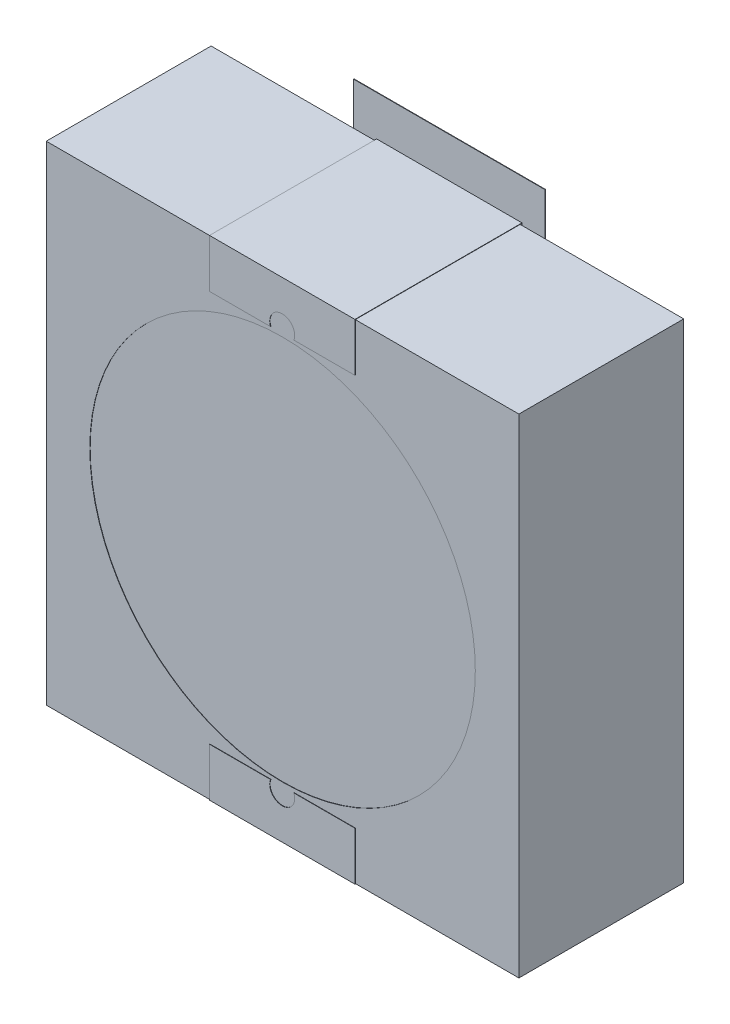
ISO-10303-21;
HEADER;
FILE_DESCRIPTION(('STEP AP214'),'2;1');
FILE_NAME('part.step','',(''),(''),'','','');
FILE_SCHEMA(('AUTOMOTIVE_DESIGN { 1 0 10303 214 1 1 1 1 }'));
ENDSEC;
DATA;
#1=APPLICATION_CONTEXT('core data for automotive mechanical design processes');
#2=APPLICATION_PROTOCOL_DEFINITION('international standard','automotive_design',2000,#1);
#3=PRODUCT_CONTEXT('',#1,'mechanical');
#4=PRODUCT('Part','Part','',(#3));
#5=PRODUCT_RELATED_PRODUCT_CATEGORY('part','',(#4));
#6=PRODUCT_DEFINITION_FORMATION('','',#4);
#7=PRODUCT_DEFINITION_CONTEXT('part definition',#1,'design');
#8=PRODUCT_DEFINITION('design','',#6,#7);
#9=PRODUCT_DEFINITION_SHAPE('','',#8);
#10=(LENGTH_UNIT() NAMED_UNIT(*) SI_UNIT(.MILLI.,.METRE.));
#11=(NAMED_UNIT(*) PLANE_ANGLE_UNIT() SI_UNIT($,.RADIAN.));
#12=(NAMED_UNIT(*) SI_UNIT($,.STERADIAN.) SOLID_ANGLE_UNIT());
#13=UNCERTAINTY_MEASURE_WITH_UNIT(LENGTH_MEASURE(1.E-05),#10,'distance_accuracy_value','');
#14=(GEOMETRIC_REPRESENTATION_CONTEXT(3) GLOBAL_UNCERTAINTY_ASSIGNED_CONTEXT((#13)) GLOBAL_UNIT_ASSIGNED_CONTEXT((#10,
#11,#12)) REPRESENTATION_CONTEXT('',''));
#15=CARTESIAN_POINT('',(0.,0.,0.));
#16=DIRECTION('',(0.,0.,1.));
#17=DIRECTION('',(1.,0.,0.));
#18=AXIS2_PLACEMENT_3D('',#15,#16,#17);
#19=CARTESIAN_POINT('',(-1.524,4.10972,0.0762));
#20=DIRECTION('',(0.,0.,-1.));
#21=DIRECTION('',(-1.,0.,0.));
#22=AXIS2_PLACEMENT_3D('',#19,#20,#21);
#23=PLANE('',#22);
#24=DIRECTION('',(1.,0.,0.));
#25=VECTOR('',#24,1.);
#26=CARTESIAN_POINT('',(2.0049998,-1.6500094,0.0762));
#27=LINE('',#26,#25);
#28=CARTESIAN_POINT('',(2.0049998,-1.6500094,0.0762));
#29=VERTEX_POINT('',#28);
#30=CARTESIAN_POINT('',(-2.0049998,-1.6500094,0.0762));
#31=VERTEX_POINT('',#30);
#32=EDGE_CURVE('E252',#29,#31,#27,.F.);
#33=ORIENTED_EDGE('',*,*,#32,.F.);
#34=DIRECTION('',(0.,1.,0.));
#35=VECTOR('',#34,1.);
#36=CARTESIAN_POINT('',(2.0049998,-5.9699906,0.0762));
#37=LINE('',#36,#35);
#38=CARTESIAN_POINT('',(2.0049998,-5.9699906,0.0762));
#39=VERTEX_POINT('',#38);
#40=EDGE_CURVE('E344',#39,#29,#37,.T.);
#41=ORIENTED_EDGE('',*,*,#40,.F.);
#42=DIRECTION('',(1.,0.,0.));
#43=VECTOR('',#42,1.);
#44=CARTESIAN_POINT('',(-2.0049998,-5.9699906,0.0762));
#45=LINE('',#44,#43);
#46=CARTESIAN_POINT('',(-2.0049998,-5.9699906,0.0762));
#47=VERTEX_POINT('',#46);
#48=EDGE_CURVE('E352',#47,#39,#45,.T.);
#49=ORIENTED_EDGE('',*,*,#48,.F.);
#50=DIRECTION('',(0.,1.,0.));
#51=VECTOR('',#50,1.);
#52=CARTESIAN_POINT('',(-2.0049998,-1.6500094,0.0762));
#53=LINE('',#52,#51);
#54=EDGE_CURVE('E357',#31,#47,#53,.F.);
#55=ORIENTED_EDGE('',*,*,#54,.F.);
#56=EDGE_LOOP('',(#33,#41,#49,#55));
#57=FACE_BOUND('',#56,.T.);
#58=ADVANCED_FACE('F16',(#57),#23,.T.);
#59=CARTESIAN_POINT('',(-1.524,4.10972,0.0762));
#60=DIRECTION('',(0.,0.,-1.));
#61=DIRECTION('',(-1.,0.,0.));
#62=AXIS2_PLACEMENT_3D('',#59,#60,#61);
#63=PLANE('',#62);
#64=DIRECTION('',(1.,0.,0.));
#65=VECTOR('',#64,1.);
#66=CARTESIAN_POINT('',(2.0049998,5.9699906,0.0762));
#67=LINE('',#66,#65);
#68=CARTESIAN_POINT('',(2.0049998,5.9699906,0.0762));
#69=VERTEX_POINT('',#68);
#70=CARTESIAN_POINT('',(-2.0049998,5.9699906,0.0762));
#71=VERTEX_POINT('',#70);
#72=EDGE_CURVE('E340',#69,#71,#67,.F.);
#73=ORIENTED_EDGE('',*,*,#72,.F.);
#74=DIRECTION('',(0.,1.,0.));
#75=VECTOR('',#74,1.);
#76=CARTESIAN_POINT('',(2.0049998,1.6500094,0.0762));
#77=LINE('',#76,#75);
#78=CARTESIAN_POINT('',(2.0049998,1.6500094,0.0762));
#79=VERTEX_POINT('',#78);
#80=EDGE_CURVE('E294',#79,#69,#77,.T.);
#81=ORIENTED_EDGE('',*,*,#80,.F.);
#82=DIRECTION('',(1.,0.,0.));
#83=VECTOR('',#82,1.);
#84=CARTESIAN_POINT('',(-2.0049998,1.6500094,0.0762));
#85=LINE('',#84,#83);
#86=CARTESIAN_POINT('',(-2.0049998,1.6500094,0.0762));
#87=VERTEX_POINT('',#86);
#88=EDGE_CURVE('E433',#87,#79,#85,.T.);
#89=ORIENTED_EDGE('',*,*,#88,.F.);
#90=DIRECTION('',(0.,1.,0.));
#91=VECTOR('',#90,1.);
#92=CARTESIAN_POINT('',(-2.0049998,5.9699906,0.0762));
#93=LINE('',#92,#91);
#94=EDGE_CURVE('E438',#71,#87,#93,.F.);
#95=ORIENTED_EDGE('',*,*,#94,.F.);
#96=EDGE_LOOP('',(#73,#81,#89,#95));
#97=FACE_BOUND('',#96,.T.);
#98=ADVANCED_FACE('F451',(#97),#63,.T.);
#99=CARTESIAN_POINT('',(-1.524,5.12572,3.58902));
#100=DIRECTION('',(0.,0.,1.));
#101=DIRECTION('',(1.,0.,0.));
#102=AXIS2_PLACEMENT_3D('',#99,#100,#101);
#103=PLANE('',#102);
#104=DIRECTION('',(1.,0.,0.));
#105=VECTOR('',#104,1.);
#106=CARTESIAN_POINT('',(-1.524,4.10972,3.58902));
#107=LINE('',#106,#105);
#108=CARTESIAN_POINT('',(-1.524,4.10972,3.58902));
#109=VERTEX_POINT('',#108);
#110=CARTESIAN_POINT('',(-0.244157293562977,4.10972,3.58902));
#111=VERTEX_POINT('',#110);
#112=EDGE_CURVE('E221',#109,#111,#107,.T.);
#113=ORIENTED_EDGE('',*,*,#112,.T.);
#114=CARTESIAN_POINT('',(0.,4.2037,3.58902));
#115=DIRECTION('',(0.,0.,1.));
#116=DIRECTION('',(1.,0.,0.));
#117=AXIS2_PLACEMENT_3D('',#114,#115,#116);
#118=CIRCLE('',#117,0.26162);
#119=CARTESIAN_POINT('',(0.244157293562981,4.10972,3.58902));
#120=VERTEX_POINT('',#119);
#121=EDGE_CURVE('E19',#111,#120,#118,.F.);
#122=ORIENTED_EDGE('',*,*,#121,.T.);
#123=DIRECTION('',(1.,0.,0.));
#124=VECTOR('',#123,1.);
#125=CARTESIAN_POINT('',(-1.524,4.10972,3.58902));
#126=LINE('',#125,#124);
#127=CARTESIAN_POINT('',(1.524,4.10972,3.58902));
#128=VERTEX_POINT('',#127);
#129=EDGE_CURVE('E264',#120,#128,#126,.T.);
#130=ORIENTED_EDGE('',*,*,#129,.T.);
#131=DIRECTION('',(0.,1.,0.));
#132=VECTOR('',#131,1.);
#133=CARTESIAN_POINT('',(1.524,5.12572,3.58902));
#134=LINE('',#133,#132);
#135=CARTESIAN_POINT('',(1.524,5.12572,3.58902));
#136=VERTEX_POINT('',#135);
#137=EDGE_CURVE('E266',#128,#136,#134,.T.);
#138=ORIENTED_EDGE('',*,*,#137,.T.);
#139=DIRECTION('',(1.,0.,0.));
#140=VECTOR('',#139,1.);
#141=CARTESIAN_POINT('',(-1.524,5.12572,3.58902));
#142=LINE('',#141,#140);
#143=CARTESIAN_POINT('',(-1.524,5.12572,3.58902));
#144=VERTEX_POINT('',#143);
#145=EDGE_CURVE('E291',#144,#136,#142,.T.);
#146=ORIENTED_EDGE('',*,*,#145,.F.);
#147=DIRECTION('',(0.,1.,0.));
#148=VECTOR('',#147,1.);
#149=CARTESIAN_POINT('',(-1.524,5.12572,3.58902));
#150=LINE('',#149,#148);
#151=EDGE_CURVE('E227',#144,#109,#150,.F.);
#152=ORIENTED_EDGE('',*,*,#151,.T.);
#153=EDGE_LOOP('',(#113,#122,#130,#138,#146,#152));
#154=FACE_BOUND('',#153,.T.);
#155=ADVANCED_FACE('F223',(#154),#103,.T.);
#156=CARTESIAN_POINT('',(0.,0.,3.57378));
#157=DIRECTION('',(0.,0.,1.));
#158=DIRECTION('',(1.,0.,0.));
#159=AXIS2_PLACEMENT_3D('',#156,#157,#158);
#160=PLANE('',#159);
#161=CARTESIAN_POINT('',(0.,0.,3.57378));
#162=DIRECTION('',(0.,0.,1.));
#163=DIRECTION('',(1.,0.,0.));
#164=AXIS2_PLACEMENT_3D('',#161,#162,#163);
#165=CIRCLE('',#164,4.0397019473008);
#166=CARTESIAN_POINT('',(4.0397019473008,0.,3.57378));
#167=VERTEX_POINT('',#166);
#168=EDGE_CURVE('E324',#167,#167,#165,.T.);
#169=ORIENTED_EDGE('',*,*,#168,.T.);
#170=EDGE_LOOP('',(#169));
#171=FACE_BOUND('',#170,.T.);
#172=ADVANCED_FACE('F733',(#171),#160,.T.);
#173=CARTESIAN_POINT('',(-1.524,-4.10972,3.58902));
#174=DIRECTION('',(0.,0.,1.));
#175=DIRECTION('',(1.,0.,0.));
#176=AXIS2_PLACEMENT_3D('',#173,#174,#175);
#177=PLANE('',#176);
#178=DIRECTION('',(1.,0.,0.));
#179=VECTOR('',#178,1.);
#180=CARTESIAN_POINT('',(-1.524,-4.10972,3.58902));
#181=LINE('',#180,#179);
#182=CARTESIAN_POINT('',(0.244157293562977,-4.10972,3.58902));
#183=VERTEX_POINT('',#182);
#184=CARTESIAN_POINT('',(1.524,-4.10972,3.58902));
#185=VERTEX_POINT('',#184);
#186=EDGE_CURVE('E329',#183,#185,#181,.T.);
#187=ORIENTED_EDGE('',*,*,#186,.F.);
#188=CARTESIAN_POINT('',(0.,-4.2037,3.58902));
#189=DIRECTION('',(0.,0.,1.));
#190=DIRECTION('',(1.,0.,0.));
#191=AXIS2_PLACEMENT_3D('',#188,#189,#190);
#192=CIRCLE('',#191,0.26162);
#193=CARTESIAN_POINT('',(-0.244157293562977,-4.10972,3.58902));
#194=VERTEX_POINT('',#193);
#195=EDGE_CURVE('E239',#183,#194,#192,.F.);
#196=ORIENTED_EDGE('',*,*,#195,.T.);
#197=DIRECTION('',(1.,0.,0.));
#198=VECTOR('',#197,1.);
#199=CARTESIAN_POINT('',(-1.524,-4.10972,3.58902));
#200=LINE('',#199,#198);
#201=CARTESIAN_POINT('',(-1.524,-4.10972,3.58902));
#202=VERTEX_POINT('',#201);
#203=EDGE_CURVE('E326',#202,#194,#200,.T.);
#204=ORIENTED_EDGE('',*,*,#203,.F.);
#205=DIRECTION('',(0.,1.,0.));
#206=VECTOR('',#205,1.);
#207=CARTESIAN_POINT('',(-1.524,-4.10972,3.58902));
#208=LINE('',#207,#206);
#209=CARTESIAN_POINT('',(-1.524,-5.12572,3.58902));
#210=VERTEX_POINT('',#209);
#211=EDGE_CURVE('E245',#202,#210,#208,.F.);
#212=ORIENTED_EDGE('',*,*,#211,.T.);
#213=DIRECTION('',(1.,0.,0.));
#214=VECTOR('',#213,1.);
#215=CARTESIAN_POINT('',(-1.524,-5.12572,3.58902));
#216=LINE('',#215,#214);
#217=CARTESIAN_POINT('',(1.524,-5.12572,3.58902));
#218=VERTEX_POINT('',#217);
#219=EDGE_CURVE('E269',#218,#210,#216,.F.);
#220=ORIENTED_EDGE('',*,*,#219,.F.);
#221=DIRECTION('',(0.,1.,0.));
#222=VECTOR('',#221,1.);
#223=CARTESIAN_POINT('',(1.524,-4.10972,3.58902));
#224=LINE('',#223,#222);
#225=EDGE_CURVE('E246',#218,#185,#224,.T.);
#226=ORIENTED_EDGE('',*,*,#225,.T.);
#227=EDGE_LOOP('',(#187,#196,#204,#212,#220,#226));
#228=FACE_BOUND('',#227,.T.);
#229=ADVANCED_FACE('F681',(#228),#177,.T.);
#230=CARTESIAN_POINT('',(2.0049998,-1.6500094,0.0762));
#231=DIRECTION('',(0.,1.,0.));
#232=DIRECTION('',(0.,0.,1.));
#233=AXIS2_PLACEMENT_3D('',#230,#231,#232);
#234=PLANE('',#233);
#235=DIRECTION('',(0.,0.,-1.));
#236=VECTOR('',#235,1.);
#237=CARTESIAN_POINT('',(2.0049998,-1.6500094,0.0762));
#238=LINE('',#237,#236);
#239=CARTESIAN_POINT('',(2.0049998,-1.6500094,0.08619999999996));
#240=VERTEX_POINT('',#239);
#241=EDGE_CURVE('E350',#29,#240,#238,.F.);
#242=ORIENTED_EDGE('',*,*,#241,.F.);
#243=ORIENTED_EDGE('',*,*,#32,.T.);
#244=DIRECTION('',(0.,0.,1.));
#245=VECTOR('',#244,1.);
#246=CARTESIAN_POINT('',(-2.0049998,-1.6500094,0.0762));
#247=LINE('',#246,#245);
#248=CARTESIAN_POINT('',(-2.0049998,-1.6500094,0.08619999999996));
#249=VERTEX_POINT('',#248);
#250=EDGE_CURVE('E359',#249,#31,#247,.F.);
#251=ORIENTED_EDGE('',*,*,#250,.F.);
#252=DIRECTION('',(1.,0.,0.));
#253=VECTOR('',#252,1.);
#254=CARTESIAN_POINT('',(0.,-1.6500094,0.08619999999996));
#255=LINE('',#254,#253);
#256=EDGE_CURVE('E271',#240,#249,#255,.F.);
#257=ORIENTED_EDGE('',*,*,#256,.F.);
#258=EDGE_LOOP('',(#242,#243,#251,#257));
#259=FACE_BOUND('',#258,.T.);
#260=ADVANCED_FACE('F726',(#259),#234,.T.);
#261=CARTESIAN_POINT('',(-2.0049998,-1.6500094,0.0762));
#262=DIRECTION('',(-1.,0.,0.));
#263=DIRECTION('',(0.,0.,1.));
#264=AXIS2_PLACEMENT_3D('',#261,#262,#263);
#265=PLANE('',#264);
#266=ORIENTED_EDGE('',*,*,#250,.T.);
#267=ORIENTED_EDGE('',*,*,#54,.T.);
#268=DIRECTION('',(0.,0.,-1.));
#269=VECTOR('',#268,1.);
#270=CARTESIAN_POINT('',(-2.0049998,-5.9699906,0.0762));
#271=LINE('',#270,#269);
#272=CARTESIAN_POINT('',(-2.0049998,-5.9699906,0.08619999999996));
#273=VERTEX_POINT('',#272);
#274=EDGE_CURVE('E354',#273,#47,#271,.T.);
#275=ORIENTED_EDGE('',*,*,#274,.F.);
#276=DIRECTION('',(0.,1.,0.));
#277=VECTOR('',#276,1.);
#278=CARTESIAN_POINT('',(-2.0049998,0.,0.08619999999996));
#279=LINE('',#278,#277);
#280=EDGE_CURVE('E485',#249,#273,#279,.F.);
#281=ORIENTED_EDGE('',*,*,#280,.F.);
#282=EDGE_LOOP('',(#266,#267,#275,#281));
#283=FACE_BOUND('',#282,.T.);
#284=ADVANCED_FACE('F722',(#283),#265,.T.);
#285=CARTESIAN_POINT('',(-2.0049998,-5.9699906,0.0762));
#286=DIRECTION('',(0.,-1.,0.));
#287=DIRECTION('',(0.,0.,-1.));
#288=AXIS2_PLACEMENT_3D('',#285,#286,#287);
#289=PLANE('',#288);
#290=ORIENTED_EDGE('',*,*,#274,.T.);
#291=ORIENTED_EDGE('',*,*,#48,.T.);
#292=DIRECTION('',(0.,0.,-1.));
#293=VECTOR('',#292,1.);
#294=CARTESIAN_POINT('',(2.0049998,-5.9699906,0.0762));
#295=LINE('',#294,#293);
#296=CARTESIAN_POINT('',(2.0049998,-5.9699906,0.08619999999996));
#297=VERTEX_POINT('',#296);
#298=EDGE_CURVE('E347',#297,#39,#295,.T.);
#299=ORIENTED_EDGE('',*,*,#298,.F.);
#300=DIRECTION('',(1.,0.,0.));
#301=VECTOR('',#300,1.);
#302=CARTESIAN_POINT('',(0.,-5.9699906,0.08619999999996));
#303=LINE('',#302,#301);
#304=EDGE_CURVE('E483',#273,#297,#303,.T.);
#305=ORIENTED_EDGE('',*,*,#304,.F.);
#306=EDGE_LOOP('',(#290,#291,#299,#305));
#307=FACE_BOUND('',#306,.T.);
#308=ADVANCED_FACE('F718',(#307),#289,.T.);
#309=CARTESIAN_POINT('',(2.0049998,-5.9699906,0.0762));
#310=DIRECTION('',(1.,0.,0.));
#311=DIRECTION('',(0.,0.,-1.));
#312=AXIS2_PLACEMENT_3D('',#309,#310,#311);
#313=PLANE('',#312);
#314=ORIENTED_EDGE('',*,*,#298,.T.);
#315=ORIENTED_EDGE('',*,*,#40,.T.);
#316=ORIENTED_EDGE('',*,*,#241,.T.);
#317=DIRECTION('',(0.,1.,0.));
#318=VECTOR('',#317,1.);
#319=CARTESIAN_POINT('',(2.0049998,0.,0.08619999999996));
#320=LINE('',#319,#318);
#321=EDGE_CURVE('E480',#297,#240,#320,.T.);
#322=ORIENTED_EDGE('',*,*,#321,.F.);
#323=EDGE_LOOP('',(#314,#315,#316,#322));
#324=FACE_BOUND('',#323,.T.);
#325=ADVANCED_FACE('F715',(#324),#313,.T.);
#326=CARTESIAN_POINT('',(2.0049998,5.9699906,0.0762));
#327=DIRECTION('',(0.,1.,0.));
#328=DIRECTION('',(0.,0.,1.));
#329=AXIS2_PLACEMENT_3D('',#326,#327,#328);
#330=PLANE('',#329);
#331=DIRECTION('',(0.,0.,-1.));
#332=VECTOR('',#331,1.);
#333=CARTESIAN_POINT('',(2.0049998,5.9699906,0.0762));
#334=LINE('',#333,#332);
#335=CARTESIAN_POINT('',(2.0049998,5.9699906,0.08619999999996));
#336=VERTEX_POINT('',#335);
#337=EDGE_CURVE('E431',#69,#336,#334,.F.);
#338=ORIENTED_EDGE('',*,*,#337,.F.);
#339=ORIENTED_EDGE('',*,*,#72,.T.);
#340=DIRECTION('',(0.,0.,1.));
#341=VECTOR('',#340,1.);
#342=CARTESIAN_POINT('',(-2.0049998,5.9699906,0.0762));
#343=LINE('',#342,#341);
#344=CARTESIAN_POINT('',(-2.0049998,5.9699906,0.08619999999996));
#345=VERTEX_POINT('',#344);
#346=EDGE_CURVE('E439',#345,#71,#343,.F.);
#347=ORIENTED_EDGE('',*,*,#346,.F.);
#348=DIRECTION('',(1.,0.,0.));
#349=VECTOR('',#348,1.);
#350=CARTESIAN_POINT('',(0.,5.9699906,0.08619999999996));
#351=LINE('',#350,#349);
#352=EDGE_CURVE('E467',#336,#345,#351,.F.);
#353=ORIENTED_EDGE('',*,*,#352,.F.);
#354=EDGE_LOOP('',(#338,#339,#347,#353));
#355=FACE_BOUND('',#354,.T.);
#356=ADVANCED_FACE('F447',(#355),#330,.T.);
#357=CARTESIAN_POINT('',(-2.0049998,5.9699906,0.0762));
#358=DIRECTION('',(-1.,0.,0.));
#359=DIRECTION('',(0.,0.,1.));
#360=AXIS2_PLACEMENT_3D('',#357,#358,#359);
#361=PLANE('',#360);
#362=ORIENTED_EDGE('',*,*,#346,.T.);
#363=ORIENTED_EDGE('',*,*,#94,.T.);
#364=DIRECTION('',(0.,0.,-1.));
#365=VECTOR('',#364,1.);
#366=CARTESIAN_POINT('',(-2.0049998,1.6500094,0.0762));
#367=LINE('',#366,#365);
#368=CARTESIAN_POINT('',(-2.0049998,1.6500094,0.08619999999996));
#369=VERTEX_POINT('',#368);
#370=EDGE_CURVE('E435',#369,#87,#367,.T.);
#371=ORIENTED_EDGE('',*,*,#370,.F.);
#372=DIRECTION('',(0.,1.,0.));
#373=VECTOR('',#372,1.);
#374=CARTESIAN_POINT('',(-2.0049998,0.,0.08619999999996));
#375=LINE('',#374,#373);
#376=EDGE_CURVE('E465',#345,#369,#375,.F.);
#377=ORIENTED_EDGE('',*,*,#376,.F.);
#378=EDGE_LOOP('',(#362,#363,#371,#377));
#379=FACE_BOUND('',#378,.T.);
#380=ADVANCED_FACE('F464',(#379),#361,.T.);
#381=CARTESIAN_POINT('',(-2.0049998,1.6500094,0.0762));
#382=DIRECTION('',(0.,-1.,0.));
#383=DIRECTION('',(0.,0.,-1.));
#384=AXIS2_PLACEMENT_3D('',#381,#382,#383);
#385=PLANE('',#384);
#386=ORIENTED_EDGE('',*,*,#370,.T.);
#387=ORIENTED_EDGE('',*,*,#88,.T.);
#388=DIRECTION('',(0.,0.,-1.));
#389=VECTOR('',#388,1.);
#390=CARTESIAN_POINT('',(2.0049998,1.6500094,0.0762));
#391=LINE('',#390,#389);
#392=CARTESIAN_POINT('',(2.0049998,1.6500094,0.08619999999996));
#393=VERTEX_POINT('',#392);
#394=EDGE_CURVE('E428',#393,#79,#391,.T.);
#395=ORIENTED_EDGE('',*,*,#394,.F.);
#396=DIRECTION('',(1.,0.,0.));
#397=VECTOR('',#396,1.);
#398=CARTESIAN_POINT('',(0.,1.6500094,0.08619999999996));
#399=LINE('',#398,#397);
#400=EDGE_CURVE('E462',#369,#393,#399,.T.);
#401=ORIENTED_EDGE('',*,*,#400,.F.);
#402=EDGE_LOOP('',(#386,#387,#395,#401));
#403=FACE_BOUND('',#402,.T.);
#404=ADVANCED_FACE('F461',(#403),#385,.T.);
#405=CARTESIAN_POINT('',(2.0049998,1.6500094,0.0762));
#406=DIRECTION('',(1.,0.,0.));
#407=DIRECTION('',(0.,0.,-1.));
#408=AXIS2_PLACEMENT_3D('',#405,#406,#407);
#409=PLANE('',#408);
#410=ORIENTED_EDGE('',*,*,#394,.T.);
#411=ORIENTED_EDGE('',*,*,#80,.T.);
#412=ORIENTED_EDGE('',*,*,#337,.T.);
#413=DIRECTION('',(0.,1.,0.));
#414=VECTOR('',#413,1.);
#415=CARTESIAN_POINT('',(2.0049998,0.,0.08619999999996));
#416=LINE('',#415,#414);
#417=EDGE_CURVE('E458',#393,#336,#416,.T.);
#418=ORIENTED_EDGE('',*,*,#417,.F.);
#419=EDGE_LOOP('',(#410,#411,#412,#418));
#420=FACE_BOUND('',#419,.T.);
#421=ADVANCED_FACE('F454',(#420),#409,.T.);
#422=CARTESIAN_POINT('',(-1.524,5.12572,0.0762));
#423=DIRECTION('',(0.,1.,0.));
#424=DIRECTION('',(0.,0.,1.));
#425=AXIS2_PLACEMENT_3D('',#422,#423,#424);
#426=PLANE('',#425);
#427=DIRECTION('',(0.,0.,-1.));
#428=VECTOR('',#427,1.);
#429=CARTESIAN_POINT('',(1.524,5.12572,0.0762));
#430=LINE('',#429,#428);
#431=CARTESIAN_POINT('',(1.524,5.12572,0.08619999999996));
#432=VERTEX_POINT('',#431);
#433=EDGE_CURVE('E307',#432,#136,#430,.F.);
#434=ORIENTED_EDGE('',*,*,#433,.F.);
#435=DIRECTION('',(1.,0.,0.));
#436=VECTOR('',#435,1.);
#437=CARTESIAN_POINT('',(0.,5.12572,0.08619999999996));
#438=LINE('',#437,#436);
#439=CARTESIAN_POINT('',(-1.524,5.12572,0.08619999999996));
#440=VERTEX_POINT('',#439);
#441=EDGE_CURVE('E505',#440,#432,#438,.T.);
#442=ORIENTED_EDGE('',*,*,#441,.F.);
#443=DIRECTION('',(0.,0.,-1.));
#444=VECTOR('',#443,1.);
#445=CARTESIAN_POINT('',(-1.524,5.12572,0.0762));
#446=LINE('',#445,#444);
#447=EDGE_CURVE('E297',#440,#144,#446,.F.);
#448=ORIENTED_EDGE('',*,*,#447,.T.);
#449=ORIENTED_EDGE('',*,*,#145,.T.);
#450=EDGE_LOOP('',(#434,#442,#448,#449));
#451=FACE_BOUND('',#450,.T.);
#452=ADVANCED_FACE('F596',(#451),#426,.T.);
#453=CARTESIAN_POINT('',(-1.524,4.10972,3.58902));
#454=DIRECTION('',(0.,-1.,0.));
#455=DIRECTION('',(0.,0.,-1.));
#456=AXIS2_PLACEMENT_3D('',#453,#454,#455);
#457=PLANE('',#456);
#458=ORIENTED_EDGE('',*,*,#129,.F.);
#459=DIRECTION('',(0.,0.,1.));
#460=VECTOR('',#459,1.);
#461=CARTESIAN_POINT('',(0.24415729356298,4.10972,3.5814));
#462=LINE('',#461,#460);
#463=CARTESIAN_POINT('',(0.244157293562981,4.10972,3.5814));
#464=VERTEX_POINT('',#463);
#465=EDGE_CURVE('E240',#120,#464,#462,.F.);
#466=ORIENTED_EDGE('',*,*,#465,.T.);
#467=DIRECTION('',(1.,0.,0.));
#468=VECTOR('',#467,1.);
#469=CARTESIAN_POINT('',(0.,4.10972,3.5814));
#470=LINE('',#469,#468);
#471=CARTESIAN_POINT('',(1.524,4.10972,3.5814));
#472=VERTEX_POINT('',#471);
#473=EDGE_CURVE('E323',#472,#464,#470,.F.);
#474=ORIENTED_EDGE('',*,*,#473,.F.);
#475=DIRECTION('',(0.,0.,-1.));
#476=VECTOR('',#475,1.);
#477=CARTESIAN_POINT('',(1.524,4.10972,0.0762));
#478=LINE('',#477,#476);
#479=EDGE_CURVE('E310',#128,#472,#478,.T.);
#480=ORIENTED_EDGE('',*,*,#479,.F.);
#481=EDGE_LOOP('',(#458,#466,#474,#480));
#482=FACE_BOUND('',#481,.T.);
#483=ADVANCED_FACE('F592',(#482),#457,.T.);
#484=CARTESIAN_POINT('',(0.,4.2037,3.5814));
#485=DIRECTION('',(0.,0.,1.));
#486=DIRECTION('',(1.,0.,0.));
#487=AXIS2_PLACEMENT_3D('',#484,#485,#486);
#488=CYLINDRICAL_SURFACE('',#487,0.26162);
#489=CARTESIAN_POINT('',(0.,4.2037,3.5814));
#490=DIRECTION('',(0.,0.,1.));
#491=DIRECTION('',(1.,0.,0.));
#492=AXIS2_PLACEMENT_3D('',#489,#490,#491);
#493=CIRCLE('',#492,0.26162);
#494=CARTESIAN_POINT('',(-0.244157293562977,4.10972,3.5814));
#495=VERTEX_POINT('',#494);
#496=EDGE_CURVE('E321',#464,#495,#493,.T.);
#497=ORIENTED_EDGE('',*,*,#496,.F.);
#498=ORIENTED_EDGE('',*,*,#465,.F.);
#499=ORIENTED_EDGE('',*,*,#121,.F.);
#500=DIRECTION('',(0.,0.,-1.));
#501=VECTOR('',#500,1.);
#502=CARTESIAN_POINT('',(-0.244157293562973,4.10972,3.58902));
#503=LINE('',#502,#501);
#504=EDGE_CURVE('E234',#495,#111,#503,.F.);
#505=ORIENTED_EDGE('',*,*,#504,.F.);
#506=EDGE_LOOP('',(#497,#498,#499,#505));
#507=FACE_BOUND('',#506,.T.);
#508=ADVANCED_FACE('F242',(#507),#488,.F.);
#509=CARTESIAN_POINT('',(-1.524,4.10972,3.58902));
#510=DIRECTION('',(0.,-1.,0.));
#511=DIRECTION('',(0.,0.,-1.));
#512=AXIS2_PLACEMENT_3D('',#509,#510,#511);
#513=PLANE('',#512);
#514=DIRECTION('',(1.,0.,0.));
#515=VECTOR('',#514,1.);
#516=CARTESIAN_POINT('',(0.,4.10972,3.5814));
#517=LINE('',#516,#515);
#518=CARTESIAN_POINT('',(-1.524,4.10972,3.5814));
#519=VERTEX_POINT('',#518);
#520=EDGE_CURVE('E236',#495,#519,#517,.F.);
#521=ORIENTED_EDGE('',*,*,#520,.F.);
#522=ORIENTED_EDGE('',*,*,#504,.T.);
#523=ORIENTED_EDGE('',*,*,#112,.F.);
#524=DIRECTION('',(0.,0.,-1.));
#525=VECTOR('',#524,1.);
#526=CARTESIAN_POINT('',(-1.524,4.10972,0.0762));
#527=LINE('',#526,#525);
#528=EDGE_CURVE('E300',#109,#519,#527,.T.);
#529=ORIENTED_EDGE('',*,*,#528,.T.);
#530=EDGE_LOOP('',(#521,#522,#523,#529));
#531=FACE_BOUND('',#530,.T.);
#532=ADVANCED_FACE('F235',(#531),#513,.T.);
#533=CARTESIAN_POINT('',(0.,-4.2037,3.5814));
#534=DIRECTION('',(0.,0.,1.));
#535=DIRECTION('',(1.,0.,0.));
#536=AXIS2_PLACEMENT_3D('',#533,#534,#535);
#537=CYLINDRICAL_SURFACE('',#536,0.26162);
#538=CARTESIAN_POINT('',(0.,-4.2037,3.5814));
#539=DIRECTION('',(0.,0.,1.));
#540=DIRECTION('',(1.,0.,0.));
#541=AXIS2_PLACEMENT_3D('',#538,#539,#540);
#542=CIRCLE('',#541,0.26162);
#543=CARTESIAN_POINT('',(-0.244157293562977,-4.10972,3.5814));
#544=VERTEX_POINT('',#543);
#545=CARTESIAN_POINT('',(0.244157293562977,-4.10972,3.5814));
#546=VERTEX_POINT('',#545);
#547=EDGE_CURVE('E318',#544,#546,#542,.T.);
#548=ORIENTED_EDGE('',*,*,#547,.F.);
#549=DIRECTION('',(0.,0.,1.));
#550=VECTOR('',#549,1.);
#551=CARTESIAN_POINT('',(-0.244157293562973,-4.10972,0.0762));
#552=LINE('',#551,#550);
#553=EDGE_CURVE('E272',#194,#544,#552,.F.);
#554=ORIENTED_EDGE('',*,*,#553,.F.);
#555=ORIENTED_EDGE('',*,*,#195,.F.);
#556=DIRECTION('',(0.,0.,1.));
#557=VECTOR('',#556,1.);
#558=CARTESIAN_POINT('',(0.244157293562973,-4.10972,0.0762));
#559=LINE('',#558,#557);
#560=EDGE_CURVE('E327',#546,#183,#559,.T.);
#561=ORIENTED_EDGE('',*,*,#560,.F.);
#562=EDGE_LOOP('',(#548,#554,#555,#561));
#563=FACE_BOUND('',#562,.T.);
#564=ADVANCED_FACE('F575',(#563),#537,.F.);
#565=CARTESIAN_POINT('',(-1.524,-4.10972,0.0762));
#566=DIRECTION('',(0.,1.,0.));
#567=DIRECTION('',(0.,0.,1.));
#568=AXIS2_PLACEMENT_3D('',#565,#566,#567);
#569=PLANE('',#568);
#570=DIRECTION('',(1.,0.,0.));
#571=VECTOR('',#570,1.);
#572=CARTESIAN_POINT('',(0.,-4.10972,3.5814));
#573=LINE('',#572,#571);
#574=CARTESIAN_POINT('',(1.524,-4.10972,3.5814));
#575=VERTEX_POINT('',#574);
#576=EDGE_CURVE('E317',#546,#575,#573,.T.);
#577=ORIENTED_EDGE('',*,*,#576,.F.);
#578=ORIENTED_EDGE('',*,*,#560,.T.);
#579=ORIENTED_EDGE('',*,*,#186,.T.);
#580=DIRECTION('',(0.,0.,-1.));
#581=VECTOR('',#580,1.);
#582=CARTESIAN_POINT('',(1.524,-4.10972,0.0762));
#583=LINE('',#582,#581);
#584=EDGE_CURVE('E278',#575,#185,#583,.F.);
#585=ORIENTED_EDGE('',*,*,#584,.F.);
#586=EDGE_LOOP('',(#577,#578,#579,#585));
#587=FACE_BOUND('',#586,.T.);
#588=ADVANCED_FACE('F576',(#587),#569,.T.);
#589=CARTESIAN_POINT('',(0.,0.,3.5814));
#590=DIRECTION('',(0.,0.,1.));
#591=DIRECTION('',(1.,0.,0.));
#592=AXIS2_PLACEMENT_3D('',#589,#590,#591);
#593=CYLINDRICAL_SURFACE('',#592,4.0397019473008);
#594=ORIENTED_EDGE('',*,*,#168,.F.);
#595=EDGE_LOOP('',(#594));
#596=FACE_BOUND('',#595,.T.);
#597=CARTESIAN_POINT('',(0.,0.,3.5814));
#598=DIRECTION('',(0.,0.,1.));
#599=DIRECTION('',(1.,0.,0.));
#600=AXIS2_PLACEMENT_3D('',#597,#598,#599);
#601=CIRCLE('',#600,4.0397019473008);
#602=CARTESIAN_POINT('',(4.0397019473008,0.,3.5814));
#603=VERTEX_POINT('',#602);
#604=EDGE_CURVE('E313',#603,#603,#601,.F.);
#605=ORIENTED_EDGE('',*,*,#604,.F.);
#606=EDGE_LOOP('',(#605));
#607=FACE_BOUND('',#606,.T.);
#608=ADVANCED_FACE('F684',(#596,#607),#593,.F.);
#609=CARTESIAN_POINT('',(-1.524,-4.10972,0.0762));
#610=DIRECTION('',(0.,1.,0.));
#611=DIRECTION('',(0.,0.,1.));
#612=AXIS2_PLACEMENT_3D('',#609,#610,#611);
#613=PLANE('',#612);
#614=ORIENTED_EDGE('',*,*,#203,.T.);
#615=ORIENTED_EDGE('',*,*,#553,.T.);
#616=DIRECTION('',(1.,0.,0.));
#617=VECTOR('',#616,1.);
#618=CARTESIAN_POINT('',(0.,-4.10972,3.5814));
#619=LINE('',#618,#617);
#620=CARTESIAN_POINT('',(-1.524,-4.10972,3.5814));
#621=VERTEX_POINT('',#620);
#622=EDGE_CURVE('E320',#621,#544,#619,.T.);
#623=ORIENTED_EDGE('',*,*,#622,.F.);
#624=DIRECTION('',(0.,0.,-1.));
#625=VECTOR('',#624,1.);
#626=CARTESIAN_POINT('',(-1.524,-4.10972,0.0762));
#627=LINE('',#626,#625);
#628=EDGE_CURVE('E285',#621,#202,#627,.F.);
#629=ORIENTED_EDGE('',*,*,#628,.T.);
#630=EDGE_LOOP('',(#614,#615,#623,#629));
#631=FACE_BOUND('',#630,.T.);
#632=ADVANCED_FACE('F682',(#631),#613,.T.);
#633=CARTESIAN_POINT('',(-1.524,-5.12572,3.58902));
#634=DIRECTION('',(0.,-1.,0.));
#635=DIRECTION('',(0.,0.,-1.));
#636=AXIS2_PLACEMENT_3D('',#633,#634,#635);
#637=PLANE('',#636);
#638=DIRECTION('',(0.,0.,-1.));
#639=VECTOR('',#638,1.);
#640=CARTESIAN_POINT('',(-1.524,-5.12572,0.0762));
#641=LINE('',#640,#639);
#642=CARTESIAN_POINT('',(-1.524,-5.12572,0.08619999999996));
#643=VERTEX_POINT('',#642);
#644=EDGE_CURVE('E281',#210,#643,#641,.T.);
#645=ORIENTED_EDGE('',*,*,#644,.T.);
#646=DIRECTION('',(1.,0.,0.));
#647=VECTOR('',#646,1.);
#648=CARTESIAN_POINT('',(0.,-5.12572,0.08619999999996));
#649=LINE('',#648,#647);
#650=CARTESIAN_POINT('',(1.524,-5.12572,0.08619999999996));
#651=VERTEX_POINT('',#650);
#652=EDGE_CURVE('E478',#651,#643,#649,.F.);
#653=ORIENTED_EDGE('',*,*,#652,.F.);
#654=DIRECTION('',(0.,0.,-1.));
#655=VECTOR('',#654,1.);
#656=CARTESIAN_POINT('',(1.524,-5.12572,0.0762));
#657=LINE('',#656,#655);
#658=EDGE_CURVE('E275',#218,#651,#657,.T.);
#659=ORIENTED_EDGE('',*,*,#658,.F.);
#660=ORIENTED_EDGE('',*,*,#219,.T.);
#661=EDGE_LOOP('',(#645,#653,#659,#660));
#662=FACE_BOUND('',#661,.T.);
#663=ADVANCED_FACE('F680',(#662),#637,.T.);
#664=CARTESIAN_POINT('',(0.,0.,0.08619999999996));
#665=DIRECTION('',(0.,0.,1.));
#666=DIRECTION('',(1.,0.,0.));
#667=AXIS2_PLACEMENT_3D('',#664,#665,#666);
#668=PLANE('',#667);
#669=ORIENTED_EDGE('',*,*,#652,.T.);
#670=DIRECTION('',(0.,1.,0.));
#671=VECTOR('',#670,1.);
#672=CARTESIAN_POINT('',(-1.524,0.,0.08619999999996));
#673=LINE('',#672,#671);
#674=CARTESIAN_POINT('',(-1.524,-4.10972,0.08619999999996));
#675=VERTEX_POINT('',#674);
#676=EDGE_CURVE('E316',#643,#675,#673,.T.);
#677=ORIENTED_EDGE('',*,*,#676,.T.);
#678=DIRECTION('',(1.,0.,0.));
#679=VECTOR('',#678,1.);
#680=CARTESIAN_POINT('',(-1.524,-4.10972,0.08619999999996));
#681=LINE('',#680,#679);
#682=CARTESIAN_POINT('',(1.524,-4.10972,0.08619999999996));
#683=VERTEX_POINT('',#682);
#684=EDGE_CURVE('E418',#683,#675,#681,.F.);
#685=ORIENTED_EDGE('',*,*,#684,.F.);
#686=DIRECTION('',(0.,1.,0.));
#687=VECTOR('',#686,1.);
#688=CARTESIAN_POINT('',(1.524,0.,0.08619999999996));
#689=LINE('',#688,#687);
#690=EDGE_CURVE('E277',#651,#683,#689,.T.);
#691=ORIENTED_EDGE('',*,*,#690,.F.);
#692=EDGE_LOOP('',(#669,#677,#685,#691));
#693=FACE_BOUND('',#692,.T.);
#694=ORIENTED_EDGE('',*,*,#304,.T.);
#695=ORIENTED_EDGE('',*,*,#321,.T.);
#696=ORIENTED_EDGE('',*,*,#256,.T.);
#697=ORIENTED_EDGE('',*,*,#280,.T.);
#698=EDGE_LOOP('',(#694,#695,#696,#697));
#699=FACE_BOUND('',#698,.T.);
#700=ADVANCED_FACE('F626',(#693,#699),#668,.T.);
#701=CARTESIAN_POINT('',(1.524,0.,0.0762));
#702=DIRECTION('',(1.,0.,0.));
#703=DIRECTION('',(0.,0.,-1.));
#704=AXIS2_PLACEMENT_3D('',#701,#702,#703);
#705=PLANE('',#704);
#706=ORIENTED_EDGE('',*,*,#658,.T.);
#707=ORIENTED_EDGE('',*,*,#690,.T.);
#708=DIRECTION('',(0.,0.,1.));
#709=VECTOR('',#708,1.);
#710=CARTESIAN_POINT('',(1.524,-4.10972,0.0762));
#711=LINE('',#710,#709);
#712=CARTESIAN_POINT('',(1.524,-4.10972,0.126200000000003));
#713=VERTEX_POINT('',#712);
#714=EDGE_CURVE('E617',#713,#683,#711,.F.);
#715=ORIENTED_EDGE('',*,*,#714,.F.);
#716=DIRECTION('',(0.,1.,0.));
#717=VECTOR('',#716,1.);
#718=CARTESIAN_POINT('',(1.524,0.,0.126200000000003));
#719=LINE('',#718,#717);
#720=CARTESIAN_POINT('',(1.524,-5.1181,0.126200000000003));
#721=VERTEX_POINT('',#720);
#722=EDGE_CURVE('E411',#713,#721,#719,.F.);
#723=ORIENTED_EDGE('',*,*,#722,.T.);
#724=DIRECTION('',(0.,0.,-1.));
#725=VECTOR('',#724,1.);
#726=CARTESIAN_POINT('',(1.524,-5.1181,0.0762));
#727=LINE('',#726,#725);
#728=CARTESIAN_POINT('',(1.524,-5.1181,3.5814));
#729=VERTEX_POINT('',#728);
#730=EDGE_CURVE('E417',#729,#721,#727,.T.);
#731=ORIENTED_EDGE('',*,*,#730,.F.);
#732=DIRECTION('',(0.,1.,0.));
#733=VECTOR('',#732,1.);
#734=CARTESIAN_POINT('',(1.524,0.,3.5814));
#735=LINE('',#734,#733);
#736=EDGE_CURVE('E391',#575,#729,#735,.F.);
#737=ORIENTED_EDGE('',*,*,#736,.F.);
#738=ORIENTED_EDGE('',*,*,#584,.T.);
#739=ORIENTED_EDGE('',*,*,#225,.F.);
#740=EDGE_LOOP('',(#706,#707,#715,#723,#731,#737,#738,#739));
#741=FACE_BOUND('',#740,.T.);
#742=ADVANCED_FACE('F520',(#741),#705,.T.);
#743=CARTESIAN_POINT('',(1.524,0.,0.0762));
#744=DIRECTION('',(1.,0.,0.));
#745=DIRECTION('',(0.,0.,-1.));
#746=AXIS2_PLACEMENT_3D('',#743,#744,#745);
#747=PLANE('',#746);
#748=DIRECTION('',(0.,0.,-1.));
#749=VECTOR('',#748,1.);
#750=CARTESIAN_POINT('',(1.524,4.10972,0.0762));
#751=LINE('',#750,#749);
#752=CARTESIAN_POINT('',(1.524,4.10972,0.126200000000003));
#753=VERTEX_POINT('',#752);
#754=CARTESIAN_POINT('',(1.524,4.10972,0.08619999999996));
#755=VERTEX_POINT('',#754);
#756=EDGE_CURVE('E470',#753,#755,#751,.T.);
#757=ORIENTED_EDGE('',*,*,#756,.T.);
#758=DIRECTION('',(0.,1.,0.));
#759=VECTOR('',#758,1.);
#760=CARTESIAN_POINT('',(1.524,0.,0.08619999999996));
#761=LINE('',#760,#759);
#762=EDGE_CURVE('E502',#432,#755,#761,.F.);
#763=ORIENTED_EDGE('',*,*,#762,.F.);
#764=ORIENTED_EDGE('',*,*,#433,.T.);
#765=ORIENTED_EDGE('',*,*,#137,.F.);
#766=ORIENTED_EDGE('',*,*,#479,.T.);
#767=DIRECTION('',(0.,1.,0.));
#768=VECTOR('',#767,1.);
#769=CARTESIAN_POINT('',(1.524,0.,3.5814));
#770=LINE('',#769,#768);
#771=CARTESIAN_POINT('',(1.524,5.1181,3.5814));
#772=VERTEX_POINT('',#771);
#773=EDGE_CURVE('E388',#772,#472,#770,.F.);
#774=ORIENTED_EDGE('',*,*,#773,.F.);
#775=DIRECTION('',(0.,0.,1.));
#776=VECTOR('',#775,1.);
#777=CARTESIAN_POINT('',(1.524,5.1181,0.0762));
#778=LINE('',#777,#776);
#779=CARTESIAN_POINT('',(1.524,5.1181,0.126200000000003));
#780=VERTEX_POINT('',#779);
#781=EDGE_CURVE('E398',#780,#772,#778,.T.);
#782=ORIENTED_EDGE('',*,*,#781,.F.);
#783=DIRECTION('',(0.,1.,0.));
#784=VECTOR('',#783,1.);
#785=CARTESIAN_POINT('',(1.524,0.,0.126200000000003));
#786=LINE('',#785,#784);
#787=EDGE_CURVE('E395',#780,#753,#786,.F.);
#788=ORIENTED_EDGE('',*,*,#787,.T.);
#789=EDGE_LOOP('',(#757,#763,#764,#765,#766,#774,#782,#788));
#790=FACE_BOUND('',#789,.T.);
#791=ADVANCED_FACE('F509',(#790),#747,.T.);
#792=CARTESIAN_POINT('',(0.,0.,0.08619999999996));
#793=DIRECTION('',(0.,0.,1.));
#794=DIRECTION('',(1.,0.,0.));
#795=AXIS2_PLACEMENT_3D('',#792,#793,#794);
#796=PLANE('',#795);
#797=DIRECTION('',(1.,0.,0.));
#798=VECTOR('',#797,1.);
#799=CARTESIAN_POINT('',(-1.524,4.10972,0.0861999999999599));
#800=LINE('',#799,#798);
#801=CARTESIAN_POINT('',(-1.524,4.10972,0.08619999999996));
#802=VERTEX_POINT('',#801);
#803=EDGE_CURVE('E601',#802,#755,#800,.T.);
#804=ORIENTED_EDGE('',*,*,#803,.F.);
#805=DIRECTION('',(0.,1.,0.));
#806=VECTOR('',#805,1.);
#807=CARTESIAN_POINT('',(-1.524,0.,0.08619999999996));
#808=LINE('',#807,#806);
#809=EDGE_CURVE('E301',#802,#440,#808,.T.);
#810=ORIENTED_EDGE('',*,*,#809,.T.);
#811=ORIENTED_EDGE('',*,*,#441,.T.);
#812=ORIENTED_EDGE('',*,*,#762,.T.);
#813=EDGE_LOOP('',(#804,#810,#811,#812));
#814=FACE_BOUND('',#813,.T.);
#815=ORIENTED_EDGE('',*,*,#400,.T.);
#816=ORIENTED_EDGE('',*,*,#417,.T.);
#817=ORIENTED_EDGE('',*,*,#352,.T.);
#818=ORIENTED_EDGE('',*,*,#376,.T.);
#819=EDGE_LOOP('',(#815,#816,#817,#818));
#820=FACE_BOUND('',#819,.T.);
#821=ADVANCED_FACE('F506',(#814,#820),#796,.T.);
#822=CARTESIAN_POINT('',(-1.524,0.,0.0762));
#823=DIRECTION('',(1.,0.,0.));
#824=DIRECTION('',(0.,0.,-1.));
#825=AXIS2_PLACEMENT_3D('',#822,#823,#824);
#826=PLANE('',#825);
#827=DIRECTION('',(0.,1.,0.));
#828=VECTOR('',#827,1.);
#829=CARTESIAN_POINT('',(-1.524,0.,0.126200000000003));
#830=LINE('',#829,#828);
#831=CARTESIAN_POINT('',(-1.524,5.1181,0.126200000000003));
#832=VERTEX_POINT('',#831);
#833=CARTESIAN_POINT('',(-1.524,4.10972,0.126200000000003));
#834=VERTEX_POINT('',#833);
#835=EDGE_CURVE('E380',#832,#834,#830,.F.);
#836=ORIENTED_EDGE('',*,*,#835,.F.);
#837=DIRECTION('',(0.,0.,1.));
#838=VECTOR('',#837,1.);
#839=CARTESIAN_POINT('',(-1.524,5.1181,0.0762));
#840=LINE('',#839,#838);
#841=CARTESIAN_POINT('',(-1.524,5.1181,3.5814));
#842=VERTEX_POINT('',#841);
#843=EDGE_CURVE('E607',#842,#832,#840,.F.);
#844=ORIENTED_EDGE('',*,*,#843,.F.);
#845=DIRECTION('',(0.,1.,0.));
#846=VECTOR('',#845,1.);
#847=CARTESIAN_POINT('',(-1.524,0.,3.5814));
#848=LINE('',#847,#846);
#849=EDGE_CURVE('E383',#519,#842,#848,.T.);
#850=ORIENTED_EDGE('',*,*,#849,.F.);
#851=ORIENTED_EDGE('',*,*,#528,.F.);
#852=ORIENTED_EDGE('',*,*,#151,.F.);
#853=ORIENTED_EDGE('',*,*,#447,.F.);
#854=ORIENTED_EDGE('',*,*,#809,.F.);
#855=DIRECTION('',(0.,0.,-1.));
#856=VECTOR('',#855,1.);
#857=CARTESIAN_POINT('',(-1.524,4.10972,3.58902));
#858=LINE('',#857,#856);
#859=EDGE_CURVE('E401',#834,#802,#858,.T.);
#860=ORIENTED_EDGE('',*,*,#859,.F.);
#861=EDGE_LOOP('',(#836,#844,#850,#851,#852,#853,#854,#860));
#862=FACE_BOUND('',#861,.T.);
#863=ADVANCED_FACE('F508',(#862),#826,.F.);
#864=CARTESIAN_POINT('',(0.,0.,3.5814));
#865=DIRECTION('',(0.,0.,1.));
#866=DIRECTION('',(1.,0.,0.));
#867=AXIS2_PLACEMENT_3D('',#864,#865,#866);
#868=PLANE('',#867);
#869=ORIENTED_EDGE('',*,*,#604,.T.);
#870=EDGE_LOOP('',(#869));
#871=FACE_BOUND('',#870,.T.);
#872=ORIENTED_EDGE('',*,*,#547,.T.);
#873=ORIENTED_EDGE('',*,*,#576,.T.);
#874=ORIENTED_EDGE('',*,*,#736,.T.);
#875=DIRECTION('',(1.,0.,0.));
#876=VECTOR('',#875,1.);
#877=CARTESIAN_POINT('',(-4.953,-5.1181,3.5814));
#878=LINE('',#877,#876);
#879=CARTESIAN_POINT('',(4.953,-5.1181,3.5814));
#880=VERTEX_POINT('',#879);
#881=EDGE_CURVE('E414',#880,#729,#878,.F.);
#882=ORIENTED_EDGE('',*,*,#881,.F.);
#883=DIRECTION('',(0.,1.,0.));
#884=VECTOR('',#883,1.);
#885=CARTESIAN_POINT('',(4.953,-5.1181,3.5814));
#886=LINE('',#885,#884);
#887=CARTESIAN_POINT('',(4.953,5.1181,3.5814));
#888=VERTEX_POINT('',#887);
#889=EDGE_CURVE('E423',#888,#880,#886,.F.);
#890=ORIENTED_EDGE('',*,*,#889,.F.);
#891=DIRECTION('',(1.,0.,0.));
#892=VECTOR('',#891,1.);
#893=CARTESIAN_POINT('',(4.953,5.1181,3.5814));
#894=LINE('',#893,#892);
#895=EDGE_CURVE('E405',#772,#888,#894,.T.);
#896=ORIENTED_EDGE('',*,*,#895,.F.);
#897=ORIENTED_EDGE('',*,*,#773,.T.);
#898=ORIENTED_EDGE('',*,*,#473,.T.);
#899=ORIENTED_EDGE('',*,*,#496,.T.);
#900=ORIENTED_EDGE('',*,*,#520,.T.);
#901=ORIENTED_EDGE('',*,*,#849,.T.);
#902=DIRECTION('',(1.,0.,0.));
#903=VECTOR('',#902,1.);
#904=CARTESIAN_POINT('',(4.953,5.1181,3.5814));
#905=LINE('',#904,#903);
#906=CARTESIAN_POINT('',(-4.953,5.1181,3.5814));
#907=VERTEX_POINT('',#906);
#908=EDGE_CURVE('E604',#907,#842,#905,.T.);
#909=ORIENTED_EDGE('',*,*,#908,.F.);
#910=DIRECTION('',(0.,1.,0.));
#911=VECTOR('',#910,1.);
#912=CARTESIAN_POINT('',(-4.953,5.1181,3.5814));
#913=LINE('',#912,#911);
#914=CARTESIAN_POINT('',(-4.953,-5.1181,3.5814));
#915=VERTEX_POINT('',#914);
#916=EDGE_CURVE('E664',#915,#907,#913,.T.);
#917=ORIENTED_EDGE('',*,*,#916,.F.);
#918=DIRECTION('',(1.,0.,0.));
#919=VECTOR('',#918,1.);
#920=CARTESIAN_POINT('',(-4.953,-5.1181,3.5814));
#921=LINE('',#920,#919);
#922=CARTESIAN_POINT('',(-1.524,-5.1181,3.5814));
#923=VERTEX_POINT('',#922);
#924=EDGE_CURVE('E661',#923,#915,#921,.F.);
#925=ORIENTED_EDGE('',*,*,#924,.F.);
#926=DIRECTION('',(0.,1.,0.));
#927=VECTOR('',#926,1.);
#928=CARTESIAN_POINT('',(-1.524,0.,3.5814));
#929=LINE('',#928,#927);
#930=EDGE_CURVE('E371',#923,#621,#929,.T.);
#931=ORIENTED_EDGE('',*,*,#930,.T.);
#932=ORIENTED_EDGE('',*,*,#622,.T.);
#933=EDGE_LOOP('',(#872,#873,#874,#882,#890,#896,#897,#898,#899,#900,#901,#909,#917,#925,#931,#932));
#934=FACE_BOUND('',#933,.T.);
#935=ADVANCED_FACE('F517',(#871,#934),#868,.T.);
#936=CARTESIAN_POINT('',(-1.524,0.,0.0762));
#937=DIRECTION('',(1.,0.,0.));
#938=DIRECTION('',(0.,0.,-1.));
#939=AXIS2_PLACEMENT_3D('',#936,#937,#938);
#940=PLANE('',#939);
#941=ORIENTED_EDGE('',*,*,#211,.F.);
#942=ORIENTED_EDGE('',*,*,#628,.F.);
#943=ORIENTED_EDGE('',*,*,#930,.F.);
#944=DIRECTION('',(0.,0.,-1.));
#945=VECTOR('',#944,1.);
#946=CARTESIAN_POINT('',(-1.524,-5.1181,0.0762));
#947=LINE('',#946,#945);
#948=CARTESIAN_POINT('',(-1.524,-5.1181,0.126200000000003));
#949=VERTEX_POINT('',#948);
#950=EDGE_CURVE('E635',#949,#923,#947,.F.);
#951=ORIENTED_EDGE('',*,*,#950,.F.);
#952=DIRECTION('',(0.,1.,0.));
#953=VECTOR('',#952,1.);
#954=CARTESIAN_POINT('',(-1.524,0.,0.126200000000003));
#955=LINE('',#954,#953);
#956=CARTESIAN_POINT('',(-1.524,-4.10972,0.126200000000003));
#957=VERTEX_POINT('',#956);
#958=EDGE_CURVE('E376',#957,#949,#955,.F.);
#959=ORIENTED_EDGE('',*,*,#958,.F.);
#960=DIRECTION('',(0.,0.,1.));
#961=VECTOR('',#960,1.);
#962=CARTESIAN_POINT('',(-1.524,-4.10972,0.0762));
#963=LINE('',#962,#961);
#964=EDGE_CURVE('E284',#675,#957,#963,.T.);
#965=ORIENTED_EDGE('',*,*,#964,.F.);
#966=ORIENTED_EDGE('',*,*,#676,.F.);
#967=ORIENTED_EDGE('',*,*,#644,.F.);
#968=EDGE_LOOP('',(#941,#942,#943,#951,#959,#965,#966,#967));
#969=FACE_BOUND('',#968,.T.);
#970=ADVANCED_FACE('F561',(#969),#940,.F.);
#971=CARTESIAN_POINT('',(-1.524,-4.10972,0.0762));
#972=DIRECTION('',(0.,1.,0.));
#973=DIRECTION('',(0.,0.,1.));
#974=AXIS2_PLACEMENT_3D('',#971,#972,#973);
#975=PLANE('',#974);
#976=ORIENTED_EDGE('',*,*,#714,.T.);
#977=ORIENTED_EDGE('',*,*,#684,.T.);
#978=ORIENTED_EDGE('',*,*,#964,.T.);
#979=DIRECTION('',(1.,0.,0.));
#980=VECTOR('',#979,1.);
#981=CARTESIAN_POINT('',(0.,-4.10972,0.126200000000003));
#982=LINE('',#981,#980);
#983=EDGE_CURVE('E638',#957,#713,#982,.T.);
#984=ORIENTED_EDGE('',*,*,#983,.T.);
#985=EDGE_LOOP('',(#976,#977,#978,#984));
#986=FACE_BOUND('',#985,.T.);
#987=ADVANCED_FACE('F557',(#986),#975,.T.);
#988=CARTESIAN_POINT('',(-4.953,-5.1181,0.0762));
#989=DIRECTION('',(0.,-1.,0.));
#990=DIRECTION('',(0.,0.,-1.));
#991=AXIS2_PLACEMENT_3D('',#988,#989,#990);
#992=PLANE('',#991);
#993=ORIENTED_EDGE('',*,*,#881,.T.);
#994=ORIENTED_EDGE('',*,*,#730,.T.);
#995=DIRECTION('',(1.,0.,0.));
#996=VECTOR('',#995,1.);
#997=CARTESIAN_POINT('',(0.,-5.1181,0.126200000000003));
#998=LINE('',#997,#996);
#999=CARTESIAN_POINT('',(4.953,-5.1181,0.126200000000003));
#1000=VERTEX_POINT('',#999);
#1001=EDGE_CURVE('E656',#721,#1000,#998,.T.);
#1002=ORIENTED_EDGE('',*,*,#1001,.T.);
#1003=DIRECTION('',(0.,0.,-1.));
#1004=VECTOR('',#1003,1.);
#1005=CARTESIAN_POINT('',(4.953,-5.1181,0.0762));
#1006=LINE('',#1005,#1004);
#1007=EDGE_CURVE('E407',#880,#1000,#1006,.T.);
#1008=ORIENTED_EDGE('',*,*,#1007,.F.);
#1009=EDGE_LOOP('',(#993,#994,#1002,#1008));
#1010=FACE_BOUND('',#1009,.T.);
#1011=ADVANCED_FACE('F553',(#1010),#992,.T.);
#1012=CARTESIAN_POINT('',(4.953,-5.1181,0.0762));
#1013=DIRECTION('',(1.,0.,0.));
#1014=DIRECTION('',(0.,0.,-1.));
#1015=AXIS2_PLACEMENT_3D('',#1012,#1013,#1014);
#1016=PLANE('',#1015);
#1017=ORIENTED_EDGE('',*,*,#1007,.T.);
#1018=DIRECTION('',(0.,1.,0.));
#1019=VECTOR('',#1018,1.);
#1020=CARTESIAN_POINT('',(4.953,0.,0.126200000000003));
#1021=LINE('',#1020,#1019);
#1022=CARTESIAN_POINT('',(4.953,5.1181,0.126200000000003));
#1023=VERTEX_POINT('',#1022);
#1024=EDGE_CURVE('E653',#1000,#1023,#1021,.T.);
#1025=ORIENTED_EDGE('',*,*,#1024,.T.);
#1026=DIRECTION('',(0.,0.,1.));
#1027=VECTOR('',#1026,1.);
#1028=CARTESIAN_POINT('',(4.953,5.1181,0.0762));
#1029=LINE('',#1028,#1027);
#1030=EDGE_CURVE('E402',#888,#1023,#1029,.F.);
#1031=ORIENTED_EDGE('',*,*,#1030,.F.);
#1032=ORIENTED_EDGE('',*,*,#889,.T.);
#1033=EDGE_LOOP('',(#1017,#1025,#1031,#1032));
#1034=FACE_BOUND('',#1033,.T.);
#1035=ADVANCED_FACE('F549',(#1034),#1016,.T.);
#1036=CARTESIAN_POINT('',(4.953,5.1181,0.0762));
#1037=DIRECTION('',(0.,1.,0.));
#1038=DIRECTION('',(0.,0.,1.));
#1039=AXIS2_PLACEMENT_3D('',#1036,#1037,#1038);
#1040=PLANE('',#1039);
#1041=DIRECTION('',(1.,0.,0.));
#1042=VECTOR('',#1041,1.);
#1043=CARTESIAN_POINT('',(0.,5.1181,0.126200000000003));
#1044=LINE('',#1043,#1042);
#1045=EDGE_CURVE('E650',#1023,#780,#1044,.F.);
#1046=ORIENTED_EDGE('',*,*,#1045,.T.);
#1047=ORIENTED_EDGE('',*,*,#781,.T.);
#1048=ORIENTED_EDGE('',*,*,#895,.T.);
#1049=ORIENTED_EDGE('',*,*,#1030,.T.);
#1050=EDGE_LOOP('',(#1046,#1047,#1048,#1049));
#1051=FACE_BOUND('',#1050,.T.);
#1052=ADVANCED_FACE('F545',(#1051),#1040,.T.);
#1053=CARTESIAN_POINT('',(-1.524,4.10972,3.58902));
#1054=DIRECTION('',(0.,-1.,0.));
#1055=DIRECTION('',(0.,0.,-1.));
#1056=AXIS2_PLACEMENT_3D('',#1053,#1054,#1055);
#1057=PLANE('',#1056);
#1058=ORIENTED_EDGE('',*,*,#859,.T.);
#1059=ORIENTED_EDGE('',*,*,#803,.T.);
#1060=ORIENTED_EDGE('',*,*,#756,.F.);
#1061=DIRECTION('',(1.,0.,0.));
#1062=VECTOR('',#1061,1.);
#1063=CARTESIAN_POINT('',(0.,4.10972,0.126200000000003));
#1064=LINE('',#1063,#1062);
#1065=EDGE_CURVE('E646',#753,#834,#1064,.F.);
#1066=ORIENTED_EDGE('',*,*,#1065,.T.);
#1067=EDGE_LOOP('',(#1058,#1059,#1060,#1066));
#1068=FACE_BOUND('',#1067,.T.);
#1069=ADVANCED_FACE('F541',(#1068),#1057,.T.);
#1070=CARTESIAN_POINT('',(4.953,5.1181,0.0762));
#1071=DIRECTION('',(0.,1.,0.));
#1072=DIRECTION('',(0.,0.,1.));
#1073=AXIS2_PLACEMENT_3D('',#1070,#1071,#1072);
#1074=PLANE('',#1073);
#1075=ORIENTED_EDGE('',*,*,#908,.T.);
#1076=ORIENTED_EDGE('',*,*,#843,.T.);
#1077=DIRECTION('',(1.,0.,0.));
#1078=VECTOR('',#1077,1.);
#1079=CARTESIAN_POINT('',(0.,5.1181,0.126200000000003));
#1080=LINE('',#1079,#1078);
#1081=CARTESIAN_POINT('',(-4.953,5.1181,0.126200000000003));
#1082=VERTEX_POINT('',#1081);
#1083=EDGE_CURVE('E644',#832,#1082,#1080,.F.);
#1084=ORIENTED_EDGE('',*,*,#1083,.T.);
#1085=DIRECTION('',(0.,0.,1.));
#1086=VECTOR('',#1085,1.);
#1087=CARTESIAN_POINT('',(-4.953,5.1181,0.0762));
#1088=LINE('',#1087,#1086);
#1089=EDGE_CURVE('E643',#907,#1082,#1088,.F.);
#1090=ORIENTED_EDGE('',*,*,#1089,.F.);
#1091=EDGE_LOOP('',(#1075,#1076,#1084,#1090));
#1092=FACE_BOUND('',#1091,.T.);
#1093=ADVANCED_FACE('F537',(#1092),#1074,.T.);
#1094=CARTESIAN_POINT('',(-4.953,5.1181,0.0762));
#1095=DIRECTION('',(-1.,0.,0.));
#1096=DIRECTION('',(0.,0.,1.));
#1097=AXIS2_PLACEMENT_3D('',#1094,#1095,#1096);
#1098=PLANE('',#1097);
#1099=ORIENTED_EDGE('',*,*,#1089,.T.);
#1100=DIRECTION('',(0.,1.,0.));
#1101=VECTOR('',#1100,1.);
#1102=CARTESIAN_POINT('',(-4.953,0.,0.126200000000003));
#1103=LINE('',#1102,#1101);
#1104=CARTESIAN_POINT('',(-4.953,-5.1181,0.126200000000003));
#1105=VERTEX_POINT('',#1104);
#1106=EDGE_CURVE('E25',#1082,#1105,#1103,.F.);
#1107=ORIENTED_EDGE('',*,*,#1106,.T.);
#1108=DIRECTION('',(0.,0.,-1.));
#1109=VECTOR('',#1108,1.);
#1110=CARTESIAN_POINT('',(-4.953,-5.1181,0.0762));
#1111=LINE('',#1110,#1109);
#1112=EDGE_CURVE('E33',#915,#1105,#1111,.T.);
#1113=ORIENTED_EDGE('',*,*,#1112,.F.);
#1114=ORIENTED_EDGE('',*,*,#916,.T.);
#1115=EDGE_LOOP('',(#1099,#1107,#1113,#1114));
#1116=FACE_BOUND('',#1115,.T.);
#1117=ADVANCED_FACE('F531',(#1116),#1098,.T.);
#1118=CARTESIAN_POINT('',(-4.953,-5.1181,0.0762));
#1119=DIRECTION('',(0.,-1.,0.));
#1120=DIRECTION('',(0.,0.,-1.));
#1121=AXIS2_PLACEMENT_3D('',#1118,#1119,#1120);
#1122=PLANE('',#1121);
#1123=DIRECTION('',(1.,0.,0.));
#1124=VECTOR('',#1123,1.);
#1125=CARTESIAN_POINT('',(0.,-5.1181,0.126200000000003));
#1126=LINE('',#1125,#1124);
#1127=EDGE_CURVE('E11',#1105,#949,#1126,.T.);
#1128=ORIENTED_EDGE('',*,*,#1127,.T.);
#1129=ORIENTED_EDGE('',*,*,#950,.T.);
#1130=ORIENTED_EDGE('',*,*,#924,.T.);
#1131=ORIENTED_EDGE('',*,*,#1112,.T.);
#1132=EDGE_LOOP('',(#1128,#1129,#1130,#1131));
#1133=FACE_BOUND('',#1132,.T.);
#1134=ADVANCED_FACE('F526',(#1133),#1122,.T.);
#1135=CARTESIAN_POINT('',(0.,0.,0.126200000000003));
#1136=DIRECTION('',(0.,0.,1.));
#1137=DIRECTION('',(1.,0.,0.));
#1138=AXIS2_PLACEMENT_3D('',#1135,#1136,#1137);
#1139=PLANE('',#1138);
#1140=ORIENTED_EDGE('',*,*,#1106,.F.);
#1141=ORIENTED_EDGE('',*,*,#1083,.F.);
#1142=ORIENTED_EDGE('',*,*,#835,.T.);
#1143=ORIENTED_EDGE('',*,*,#1065,.F.);
#1144=ORIENTED_EDGE('',*,*,#787,.F.);
#1145=ORIENTED_EDGE('',*,*,#1045,.F.);
#1146=ORIENTED_EDGE('',*,*,#1024,.F.);
#1147=ORIENTED_EDGE('',*,*,#1001,.F.);
#1148=ORIENTED_EDGE('',*,*,#722,.F.);
#1149=ORIENTED_EDGE('',*,*,#983,.F.);
#1150=ORIENTED_EDGE('',*,*,#958,.T.);
#1151=ORIENTED_EDGE('',*,*,#1127,.F.);
#1152=EDGE_LOOP('',(#1140,#1141,#1142,#1143,#1144,#1145,#1146,#1147,#1148,#1149,#1150,#1151));
#1153=FACE_BOUND('',#1152,.T.);
#1154=ADVANCED_FACE('F524',(#1153),#1139,.F.);
#1155=CLOSED_SHELL('',(#58,#98,#155,#172,#229,#260,#284,#308,#325,#356,#380,#404,#421,#452,#483,
#508,#532,#564,#588,#608,#632,#663,#700,#742,#791,#821,#863,#935,#970,#987,#1011,#1035,#1052,
#1069,#1093,#1117,#1134,#1154));
#1156=MANIFOLD_SOLID_BREP('B1',#1155);
#1157=ADVANCED_BREP_SHAPE_REPRESENTATION('',(#18,#1156),#14);
#1158=SHAPE_DEFINITION_REPRESENTATION(#9,#1157);
ENDSEC;
END-ISO-10303-21;
